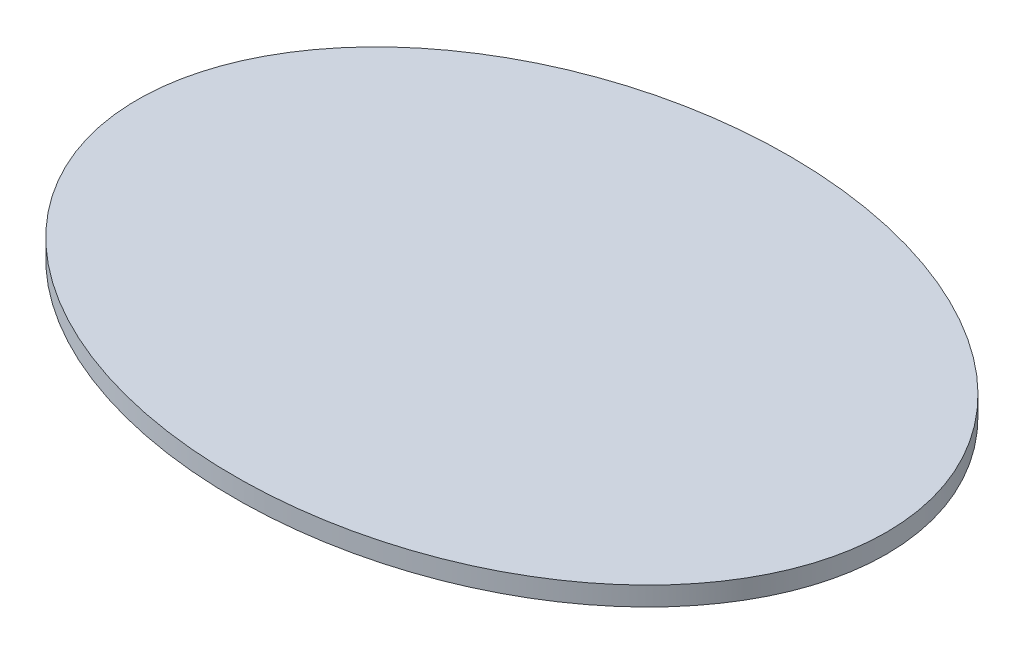
ISO-10303-21;
HEADER;
FILE_DESCRIPTION(('STEP AP214'),'2;1');
FILE_NAME('part.step','',(''),(''),'','','');
FILE_SCHEMA(('AUTOMOTIVE_DESIGN { 1 0 10303 214 1 1 1 1 }'));
ENDSEC;
DATA;
#1=APPLICATION_CONTEXT('core data for automotive mechanical design processes');
#2=APPLICATION_PROTOCOL_DEFINITION('international standard','automotive_design',2000,#1);
#3=PRODUCT_CONTEXT('',#1,'mechanical');
#4=PRODUCT('Part','Part','',(#3));
#5=PRODUCT_RELATED_PRODUCT_CATEGORY('part','',(#4));
#6=PRODUCT_DEFINITION_FORMATION('','',#4);
#7=PRODUCT_DEFINITION_CONTEXT('part definition',#1,'design');
#8=PRODUCT_DEFINITION('design','',#6,#7);
#9=PRODUCT_DEFINITION_SHAPE('','',#8);
#10=(LENGTH_UNIT() NAMED_UNIT(*) SI_UNIT(.MILLI.,.METRE.));
#11=(NAMED_UNIT(*) PLANE_ANGLE_UNIT() SI_UNIT($,.RADIAN.));
#12=(NAMED_UNIT(*) SI_UNIT($,.STERADIAN.) SOLID_ANGLE_UNIT());
#13=UNCERTAINTY_MEASURE_WITH_UNIT(LENGTH_MEASURE(1.E-05),#10,'distance_accuracy_value','');
#14=(GEOMETRIC_REPRESENTATION_CONTEXT(3) GLOBAL_UNCERTAINTY_ASSIGNED_CONTEXT((#13)) GLOBAL_UNIT_ASSIGNED_CONTEXT((#10,
#11,#12)) REPRESENTATION_CONTEXT('',''));
#15=CARTESIAN_POINT('',(0.,0.,0.));
#16=DIRECTION('',(0.,0.,1.));
#17=DIRECTION('',(1.,0.,0.));
#18=AXIS2_PLACEMENT_3D('',#15,#16,#17);
#19=CARTESIAN_POINT('',(0.,50.8,0.));
#20=DIRECTION('',(0.,1.,0.));
#21=DIRECTION('',(1.,0.,0.));
#22=AXIS2_PLACEMENT_3D('',#19,#20,#21);
#23=ELLIPSE('',#22,1000.633,740.9434);
#24=DIRECTION('',(0.,-1.,0.));
#25=VECTOR('',#24,1.);
#26=SURFACE_OF_LINEAR_EXTRUSION('',#23,#25);
#27=CARTESIAN_POINT('',(1000.633,50.8,0.));
#28=VERTEX_POINT('',#27);
#29=EDGE_CURVE('E10',#28,#28,#23,.T.);
#30=ORIENTED_EDGE('',*,*,#29,.F.);
#31=EDGE_LOOP('',(#30));
#32=FACE_BOUND('',#31,.T.);
#33=CARTESIAN_POINT('',(0.,0.,0.));
#34=DIRECTION('',(0.,1.,0.));
#35=DIRECTION('',(1.,0.,0.));
#36=AXIS2_PLACEMENT_3D('',#33,#34,#35);
#37=ELLIPSE('',#36,1000.633,740.9434);
#38=CARTESIAN_POINT('',(1000.633,0.,0.));
#39=VERTEX_POINT('',#38);
#40=EDGE_CURVE('E38',#39,#39,#37,.T.);
#41=ORIENTED_EDGE('',*,*,#40,.T.);
#42=EDGE_LOOP('',(#41));
#43=FACE_BOUND('',#42,.T.);
#44=ADVANCED_FACE('F34',(#32,#43),#26,.F.);
#45=CARTESIAN_POINT('',(0.,50.8,0.));
#46=DIRECTION('',(0.,1.,0.));
#47=DIRECTION('',(0.,0.,1.));
#48=AXIS2_PLACEMENT_3D('',#45,#46,#47);
#49=PLANE('',#48);
#50=ORIENTED_EDGE('',*,*,#29,.T.);
#51=EDGE_LOOP('',(#50));
#52=FACE_BOUND('',#51,.T.);
#53=ADVANCED_FACE('F50',(#52),#49,.T.);
#54=CARTESIAN_POINT('',(0.,0.,0.));
#55=DIRECTION('',(0.,1.,0.));
#56=DIRECTION('',(0.,0.,1.));
#57=AXIS2_PLACEMENT_3D('',#54,#55,#56);
#58=PLANE('',#57);
#59=ORIENTED_EDGE('',*,*,#40,.F.);
#60=EDGE_LOOP('',(#59));
#61=FACE_BOUND('',#60,.T.);
#62=ADVANCED_FACE('F48',(#61),#58,.F.);
#63=CLOSED_SHELL('',(#44,#53,#62));
#64=MANIFOLD_SOLID_BREP('B2',#63);
#65=ADVANCED_BREP_SHAPE_REPRESENTATION('',(#18,#64),#14);
#66=SHAPE_DEFINITION_REPRESENTATION(#9,#65);
ENDSEC;
END-ISO-10303-21;
